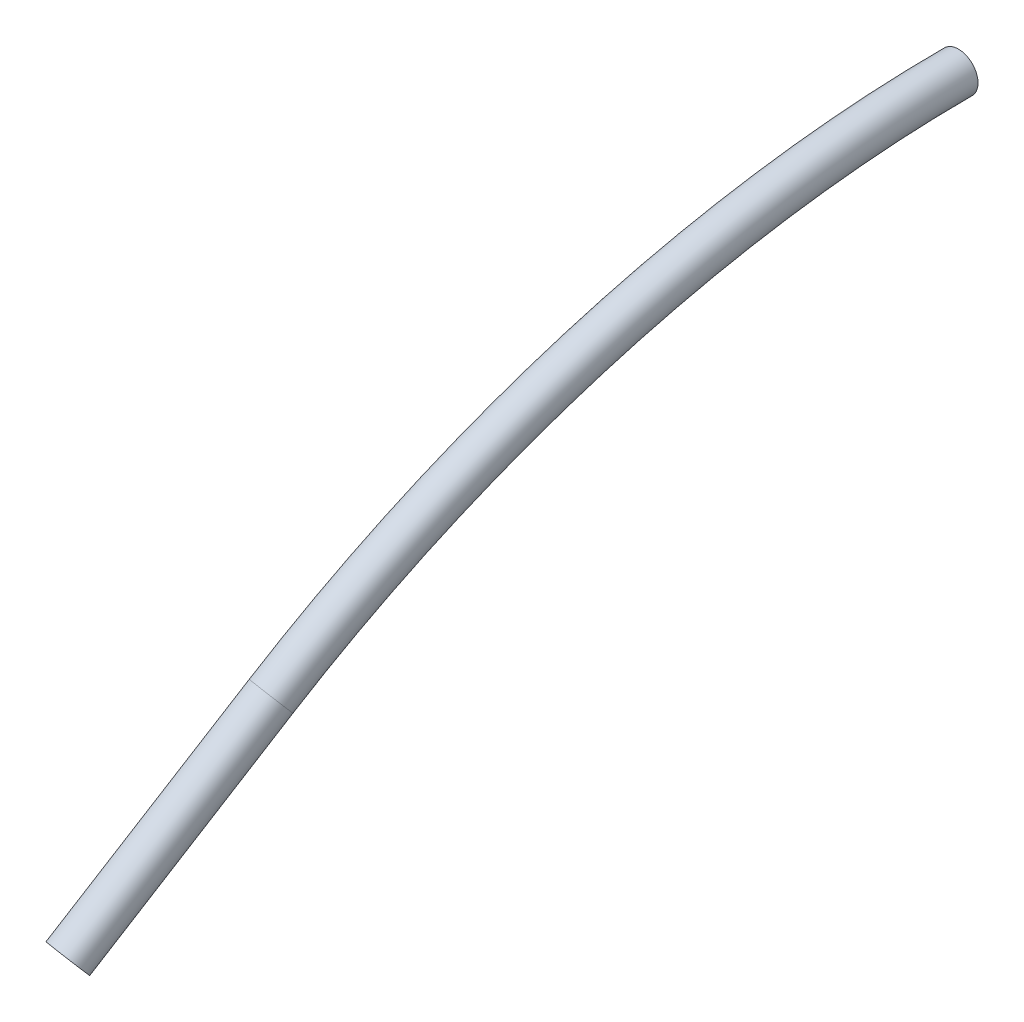
ISO-10303-21;
HEADER;
FILE_DESCRIPTION(('STEP AP214'),'2;1');
FILE_NAME('part.step','',(''),(''),'','','');
FILE_SCHEMA(('AUTOMOTIVE_DESIGN { 1 0 10303 214 1 1 1 1 }'));
ENDSEC;
DATA;
#1=APPLICATION_CONTEXT('core data for automotive mechanical design processes');
#2=APPLICATION_PROTOCOL_DEFINITION('international standard','automotive_design',2000,#1);
#3=PRODUCT_CONTEXT('',#1,'mechanical');
#4=PRODUCT('Part','Part','',(#3));
#5=PRODUCT_RELATED_PRODUCT_CATEGORY('part','',(#4));
#6=PRODUCT_DEFINITION_FORMATION('','',#4);
#7=PRODUCT_DEFINITION_CONTEXT('part definition',#1,'design');
#8=PRODUCT_DEFINITION('design','',#6,#7);
#9=PRODUCT_DEFINITION_SHAPE('','',#8);
#10=(LENGTH_UNIT() NAMED_UNIT(*) SI_UNIT(.MILLI.,.METRE.));
#11=(NAMED_UNIT(*) PLANE_ANGLE_UNIT() SI_UNIT($,.RADIAN.));
#12=(NAMED_UNIT(*) SI_UNIT($,.STERADIAN.) SOLID_ANGLE_UNIT());
#13=UNCERTAINTY_MEASURE_WITH_UNIT(LENGTH_MEASURE(1.E-05),#10,'distance_accuracy_value','');
#14=(GEOMETRIC_REPRESENTATION_CONTEXT(3) GLOBAL_UNCERTAINTY_ASSIGNED_CONTEXT((#13)) GLOBAL_UNIT_ASSIGNED_CONTEXT((#10,
#11,#12)) REPRESENTATION_CONTEXT('',''));
#15=CARTESIAN_POINT('',(0.,0.,0.));
#16=DIRECTION('',(0.,0.,1.));
#17=DIRECTION('',(1.,0.,0.));
#18=AXIS2_PLACEMENT_3D('',#15,#16,#17);
#19=CARTESIAN_POINT('',(3791.03057439525,3000.74019706794,1673.25351344162));
#20=DIRECTION('',(-0.116604987864152,-0.65188441638209,0.749299662674008));
#21=DIRECTION('',(0.,-0.754446214782206,-0.656361873512472));
#22=AXIS2_PLACEMENT_3D('',#19,#20,#21);
#23=CYLINDRICAL_SURFACE('',#22,50.7999999999575);
#24=CARTESIAN_POINT('',(3791.03057439525,3000.74019706794,1673.25351344162));
#25=DIRECTION('',(-0.116604987864151,-0.651884416382087,0.749299662674011));
#26=DIRECTION('',(0.0434533751323479,-0.757072329350236,-0.651884416382087));
#27=AXIS2_PLACEMENT_3D('',#24,#25,#26);
#28=CIRCLE('',#27,50.7999999999575);
#29=CARTESIAN_POINT('',(3797.73291990334,3038.20990286669,1706.89485277347));
#30=VERTEX_POINT('',#29);
#31=EDGE_CURVE('E30',#30,#30,#28,.T.);
#32=ORIENTED_EDGE('',*,*,#31,.T.);
#33=EDGE_LOOP('',(#32));
#34=FACE_BOUND('',#33,.T.);
#35=CARTESIAN_POINT('',(3719.94817379326,2603.35145684141,2130.02658780769));
#36=DIRECTION('',(-0.116604987864151,-0.651884416382087,0.749299662674011));
#37=DIRECTION('',(0.0434533751323479,-0.757072329350236,-0.651884416382087));
#38=AXIS2_PLACEMENT_3D('',#35,#36,#37);
#39=CIRCLE('',#38,50.7999999999575);
#40=CARTESIAN_POINT('',(3722.15560524998,2564.89218251045,2096.91085945551));
#41=VERTEX_POINT('',#40);
#42=EDGE_CURVE('E10',#41,#41,#39,.T.);
#43=ORIENTED_EDGE('',*,*,#42,.F.);
#44=EDGE_LOOP('',(#43));
#45=FACE_BOUND('',#44,.T.);
#46=ADVANCED_FACE('F24',(#34,#45),#23,.T.);
#47=CARTESIAN_POINT('',(3457.66919840796,1137.07132654774,-4.59632332194815E-11));
#48=DIRECTION('',(-0.984376038822768,0.176078999859712,0.));
#49=DIRECTION('',(-0.176078999859712,-0.984376038822768,0.));
#50=AXIS2_PLACEMENT_3D('',#47,#48,#49);
#51=TOROIDAL_SURFACE('',#50,2526.69127243339,50.7999999999575);
#52=CARTESIAN_POINT('',(3902.56647061229,3624.28567263377,-2.16038017372407E-12));
#53=DIRECTION('',(0.,0.,1.));
#54=DIRECTION('',(0.,-1.,0.));
#55=AXIS2_PLACEMENT_3D('',#52,#53,#54);
#56=CIRCLE('',#55,50.7999999999575);
#57=CARTESIAN_POINT('',(3911.51128380516,3674.29197540593,-1.27970869676139E-12));
#58=VERTEX_POINT('',#57);
#59=EDGE_CURVE('E34',#58,#58,#56,.T.);
#60=CARTESIAN_POINT('',(3457.66919840796,1137.07132654774,-4.59632332194815E-11));
#61=DIRECTION('',(-0.984376038822768,0.176078999859712,0.));
#62=DIRECTION('',(-0.176078999859712,-0.984376038822768,0.));
#63=AXIS2_PLACEMENT_3D('',#60,#61,#62);
#64=CIRCLE('',#63,2577.49127243334);
#65=EDGE_CURVE('',#30,#58,#64,.T.);
#66=ORIENTED_EDGE('',*,*,#31,.F.);
#67=ORIENTED_EDGE('',*,*,#59,.T.);
#68=ORIENTED_EDGE('',*,*,#65,.T.);
#69=ORIENTED_EDGE('',*,*,#65,.F.);
#70=EDGE_LOOP('',(#66,#68,#67,#69));
#71=FACE_BOUND('',#70,.T.);
#72=ADVANCED_FACE('F41',(#71),#51,.T.);
#73=CARTESIAN_POINT('',(3719.94817379326,2603.35145684141,2130.02658780769));
#74=DIRECTION('',(-0.116604987864151,-0.651884416382087,0.749299662674011));
#75=DIRECTION('',(0.0434533751323479,-0.757072329350236,-0.651884416382087));
#76=AXIS2_PLACEMENT_3D('',#73,#74,#75);
#77=PLANE('',#76);
#78=ORIENTED_EDGE('',*,*,#42,.T.);
#79=EDGE_LOOP('',(#78));
#80=FACE_BOUND('',#79,.T.);
#81=ADVANCED_FACE('F45',(#80),#77,.T.);
#82=CARTESIAN_POINT('',(3902.56647061229,3624.28567263377,-2.16038017372407E-12));
#83=DIRECTION('',(0.,0.,1.));
#84=DIRECTION('',(0.,-1.,0.));
#85=AXIS2_PLACEMENT_3D('',#82,#83,#84);
#86=PLANE('',#85);
#87=ORIENTED_EDGE('',*,*,#59,.F.);
#88=EDGE_LOOP('',(#87));
#89=FACE_BOUND('',#88,.T.);
#90=ADVANCED_FACE('F43',(#89),#86,.F.);
#91=CLOSED_SHELL('',(#46,#72,#81,#90));
#92=MANIFOLD_SOLID_BREP('B2',#91);
#93=ADVANCED_BREP_SHAPE_REPRESENTATION('',(#18,#92),#14);
#94=SHAPE_DEFINITION_REPRESENTATION(#9,#93);
ENDSEC;
END-ISO-10303-21;
